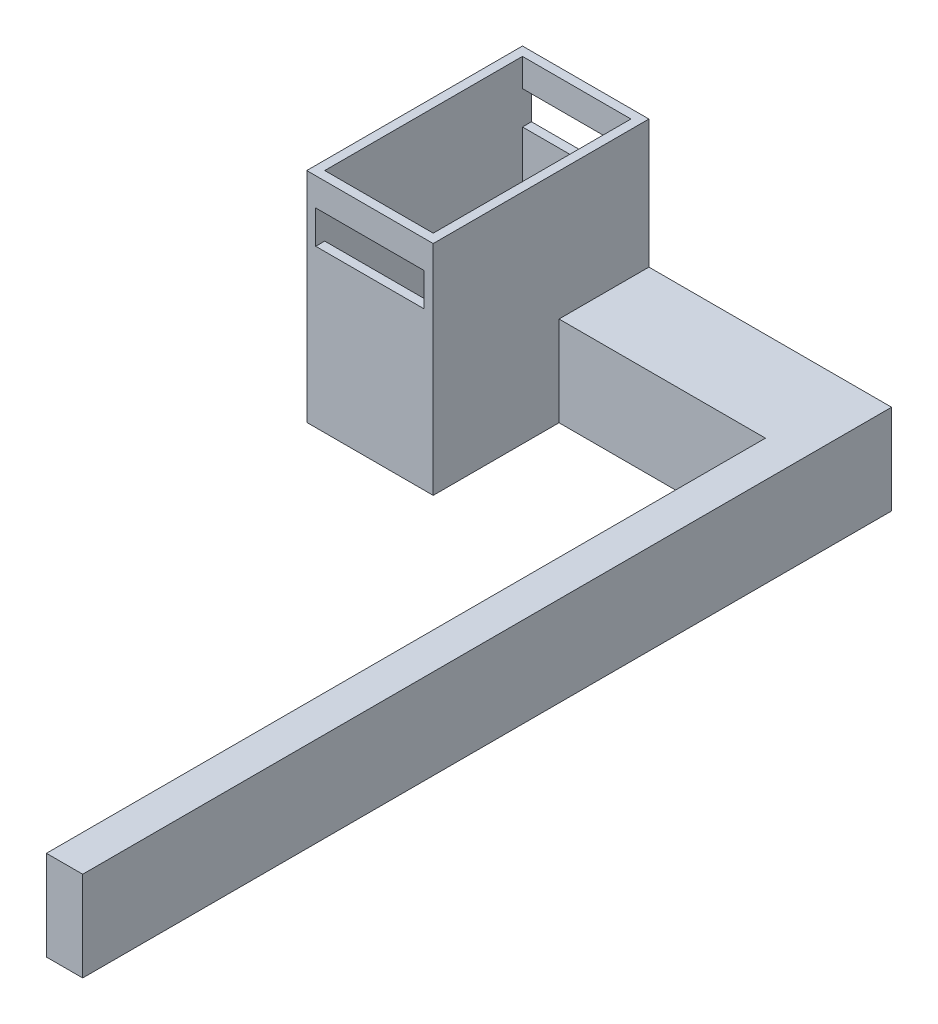
ISO-10303-21;
HEADER;
FILE_DESCRIPTION(('STEP AP214'),'2;1');
FILE_NAME('part.step','',(''),(''),'','','');
FILE_SCHEMA(('AUTOMOTIVE_DESIGN { 1 0 10303 214 1 1 1 1 }'));
ENDSEC;
DATA;
#1=APPLICATION_CONTEXT('core data for automotive mechanical design processes');
#2=APPLICATION_PROTOCOL_DEFINITION('international standard','automotive_design',2000,#1);
#3=PRODUCT_CONTEXT('',#1,'mechanical');
#4=PRODUCT('Part','Part','',(#3));
#5=PRODUCT_RELATED_PRODUCT_CATEGORY('part','',(#4));
#6=PRODUCT_DEFINITION_FORMATION('','',#4);
#7=PRODUCT_DEFINITION_CONTEXT('part definition',#1,'design');
#8=PRODUCT_DEFINITION('design','',#6,#7);
#9=PRODUCT_DEFINITION_SHAPE('','',#8);
#10=(LENGTH_UNIT() NAMED_UNIT(*) SI_UNIT(.MILLI.,.METRE.));
#11=(NAMED_UNIT(*) PLANE_ANGLE_UNIT() SI_UNIT($,.RADIAN.));
#12=(NAMED_UNIT(*) SI_UNIT($,.STERADIAN.) SOLID_ANGLE_UNIT());
#13=UNCERTAINTY_MEASURE_WITH_UNIT(LENGTH_MEASURE(1.E-05),#10,'distance_accuracy_value','');
#14=(GEOMETRIC_REPRESENTATION_CONTEXT(3) GLOBAL_UNCERTAINTY_ASSIGNED_CONTEXT((#13)) GLOBAL_UNIT_ASSIGNED_CONTEXT((#10,
#11,#12)) REPRESENTATION_CONTEXT('',''));
#15=CARTESIAN_POINT('',(0.,0.,0.));
#16=DIRECTION('',(0.,0.,1.));
#17=DIRECTION('',(1.,0.,0.));
#18=AXIS2_PLACEMENT_3D('',#15,#16,#17);
#19=CARTESIAN_POINT('',(41.07,0.,-14.));
#20=DIRECTION('',(0.,0.,-1.));
#21=DIRECTION('',(-1.,0.,0.));
#22=AXIS2_PLACEMENT_3D('',#19,#20,#21);
#23=PLANE('',#22);
#24=DIRECTION('',(0.,-1.,0.));
#25=VECTOR('',#24,1.);
#26=CARTESIAN_POINT('',(37.035,0.,-14.));
#27=LINE('',#26,#25);
#28=CARTESIAN_POINT('',(37.035,10.,-14.));
#29=VERTEX_POINT('',#28);
#30=CARTESIAN_POINT('',(37.035,0.,-14.));
#31=VERTEX_POINT('',#30);
#32=EDGE_CURVE('E220',#29,#31,#27,.T.);
#33=ORIENTED_EDGE('',*,*,#32,.F.);
#34=DIRECTION('',(-1.,0.,0.));
#35=VECTOR('',#34,1.);
#36=CARTESIAN_POINT('',(41.07,10.,-14.));
#37=LINE('',#36,#35);
#38=CARTESIAN_POINT('',(14.07,10.,-14.));
#39=VERTEX_POINT('',#38);
#40=EDGE_CURVE('E246',#29,#39,#37,.T.);
#41=ORIENTED_EDGE('',*,*,#40,.T.);
#42=DIRECTION('',(0.,-1.,0.));
#43=VECTOR('',#42,1.);
#44=CARTESIAN_POINT('',(14.07,0.,-14.));
#45=LINE('',#44,#43);
#46=CARTESIAN_POINT('',(14.07,0.,-14.));
#47=VERTEX_POINT('',#46);
#48=EDGE_CURVE('E235',#39,#47,#45,.T.);
#49=ORIENTED_EDGE('',*,*,#48,.T.);
#50=DIRECTION('',(-1.,0.,0.));
#51=VECTOR('',#50,1.);
#52=CARTESIAN_POINT('',(41.07,0.,-14.));
#53=LINE('',#52,#51);
#54=EDGE_CURVE('E67',#31,#47,#53,.T.);
#55=ORIENTED_EDGE('',*,*,#54,.F.);
#56=EDGE_LOOP('',(#33,#41,#49,#55));
#57=FACE_BOUND('',#56,.T.);
#58=ADVANCED_FACE('F43',(#57),#23,.F.);
#59=CARTESIAN_POINT('',(14.07,24.27,0.));
#60=DIRECTION('',(-1.,0.,0.));
#61=DIRECTION('',(0.,0.,1.));
#62=AXIS2_PLACEMENT_3D('',#59,#60,#61);
#63=PLANE('',#62);
#64=ORIENTED_EDGE('',*,*,#48,.F.);
#65=DIRECTION('',(0.,0.,1.));
#66=VECTOR('',#65,1.);
#67=CARTESIAN_POINT('',(14.07,10.,-24.));
#68=LINE('',#67,#66);
#69=CARTESIAN_POINT('',(14.07,10.,-24.));
#70=VERTEX_POINT('',#69);
#71=EDGE_CURVE('E59',#70,#39,#68,.T.);
#72=ORIENTED_EDGE('',*,*,#71,.F.);
#73=DIRECTION('',(0.,-1.,0.));
#74=VECTOR('',#73,1.);
#75=CARTESIAN_POINT('',(14.07,24.27,-24.));
#76=LINE('',#75,#74);
#77=CARTESIAN_POINT('',(14.07,24.27,-24.));
#78=VERTEX_POINT('',#77);
#79=EDGE_CURVE('E399',#78,#70,#76,.T.);
#80=ORIENTED_EDGE('',*,*,#79,.F.);
#81=DIRECTION('',(0.,0.,-1.));
#82=VECTOR('',#81,1.);
#83=CARTESIAN_POINT('',(14.07,24.27,0.));
#84=LINE('',#83,#82);
#85=CARTESIAN_POINT('',(14.07,24.27,0.));
#86=VERTEX_POINT('',#85);
#87=EDGE_CURVE('E378',#86,#78,#84,.T.);
#88=ORIENTED_EDGE('',*,*,#87,.F.);
#89=DIRECTION('',(0.,-1.,0.));
#90=VECTOR('',#89,1.);
#91=CARTESIAN_POINT('',(14.07,24.27,0.));
#92=LINE('',#91,#90);
#93=CARTESIAN_POINT('',(14.07,0.,0.));
#94=VERTEX_POINT('',#93);
#95=EDGE_CURVE('E52',#86,#94,#92,.T.);
#96=ORIENTED_EDGE('',*,*,#95,.T.);
#97=DIRECTION('',(0.,0.,-1.));
#98=VECTOR('',#97,1.);
#99=CARTESIAN_POINT('',(14.07,0.,0.));
#100=LINE('',#99,#98);
#101=EDGE_CURVE('E391',#94,#47,#100,.T.);
#102=ORIENTED_EDGE('',*,*,#101,.T.);
#103=EDGE_LOOP('',(#64,#72,#80,#88,#96,#102));
#104=FACE_BOUND('',#103,.T.);
#105=ADVANCED_FACE('F405',(#104),#63,.F.);
#106=CARTESIAN_POINT('',(13.07,1.,-23.));
#107=DIRECTION('',(0.,0.,-1.));
#108=DIRECTION('',(-1.,0.,0.));
#109=AXIS2_PLACEMENT_3D('',#106,#107,#108);
#110=PLANE('',#109);
#111=DIRECTION('',(0.,1.,0.));
#112=VECTOR('',#111,1.);
#113=CARTESIAN_POINT('',(13.07,1.,-23.));
#114=LINE('',#113,#112);
#115=CARTESIAN_POINT('',(13.07,1.,-23.));
#116=VERTEX_POINT('',#115);
#117=CARTESIAN_POINT('',(13.07,17.47,-23.));
#118=VERTEX_POINT('',#117);
#119=EDGE_CURVE('E350',#116,#118,#114,.T.);
#120=ORIENTED_EDGE('',*,*,#119,.T.);
#121=DIRECTION('',(-1.,0.,0.));
#122=VECTOR('',#121,1.);
#123=CARTESIAN_POINT('',(13.07,17.47,-23.));
#124=LINE('',#123,#122);
#125=CARTESIAN_POINT('',(1.,17.47,-23.));
#126=VERTEX_POINT('',#125);
#127=EDGE_CURVE('E301',#118,#126,#124,.T.);
#128=ORIENTED_EDGE('',*,*,#127,.T.);
#129=DIRECTION('',(0.,1.,0.));
#130=VECTOR('',#129,1.);
#131=CARTESIAN_POINT('',(1.,1.,-23.));
#132=LINE('',#131,#130);
#133=CARTESIAN_POINT('',(1.,1.,-23.));
#134=VERTEX_POINT('',#133);
#135=EDGE_CURVE('E366',#134,#126,#132,.T.);
#136=ORIENTED_EDGE('',*,*,#135,.F.);
#137=DIRECTION('',(-1.,0.,0.));
#138=VECTOR('',#137,1.);
#139=CARTESIAN_POINT('',(13.07,1.,-23.));
#140=LINE('',#139,#138);
#141=EDGE_CURVE('E318',#116,#134,#140,.T.);
#142=ORIENTED_EDGE('',*,*,#141,.F.);
#143=EDGE_LOOP('',(#120,#128,#136,#142));
#144=FACE_BOUND('',#143,.T.);
#145=ADVANCED_FACE('F435',(#144),#110,.F.);
#146=CARTESIAN_POINT('',(1.,1.,-1.));
#147=DIRECTION('',(0.,0.,1.));
#148=DIRECTION('',(1.,0.,0.));
#149=AXIS2_PLACEMENT_3D('',#146,#147,#148);
#150=PLANE('',#149);
#151=DIRECTION('',(0.,1.,0.));
#152=VECTOR('',#151,1.);
#153=CARTESIAN_POINT('',(1.,1.,-1.));
#154=LINE('',#153,#152);
#155=CARTESIAN_POINT('',(1.,1.,-1.));
#156=VERTEX_POINT('',#155);
#157=CARTESIAN_POINT('',(1.,17.47,-1.));
#158=VERTEX_POINT('',#157);
#159=EDGE_CURVE('E361',#156,#158,#154,.T.);
#160=ORIENTED_EDGE('',*,*,#159,.T.);
#161=DIRECTION('',(1.,0.,0.));
#162=VECTOR('',#161,1.);
#163=CARTESIAN_POINT('',(1.,17.47,-1.));
#164=LINE('',#163,#162);
#165=CARTESIAN_POINT('',(13.07,17.47,-1.));
#166=VERTEX_POINT('',#165);
#167=EDGE_CURVE('E297',#158,#166,#164,.T.);
#168=ORIENTED_EDGE('',*,*,#167,.T.);
#169=DIRECTION('',(0.,1.,0.));
#170=VECTOR('',#169,1.);
#171=CARTESIAN_POINT('',(13.07,1.,-1.));
#172=LINE('',#171,#170);
#173=CARTESIAN_POINT('',(13.07,1.,-1.));
#174=VERTEX_POINT('',#173);
#175=EDGE_CURVE('E356',#174,#166,#172,.T.);
#176=ORIENTED_EDGE('',*,*,#175,.F.);
#177=DIRECTION('',(1.,0.,0.));
#178=VECTOR('',#177,1.);
#179=CARTESIAN_POINT('',(1.,1.,-1.));
#180=LINE('',#179,#178);
#181=EDGE_CURVE('E327',#156,#174,#180,.T.);
#182=ORIENTED_EDGE('',*,*,#181,.F.);
#183=EDGE_LOOP('',(#160,#168,#176,#182));
#184=FACE_BOUND('',#183,.T.);
#185=ADVANCED_FACE('F464',(#184),#150,.F.);
#186=CARTESIAN_POINT('',(0.,24.27,0.));
#187=DIRECTION('',(1.,0.,0.));
#188=DIRECTION('',(0.,0.,-1.));
#189=AXIS2_PLACEMENT_3D('',#186,#187,#188);
#190=PLANE('',#189);
#191=DIRECTION('',(0.,0.,1.));
#192=VECTOR('',#191,1.);
#193=CARTESIAN_POINT('',(0.,0.,0.));
#194=LINE('',#193,#192);
#195=CARTESIAN_POINT('',(0.,0.,-24.));
#196=VERTEX_POINT('',#195);
#197=CARTESIAN_POINT('',(0.,0.,0.));
#198=VERTEX_POINT('',#197);
#199=EDGE_CURVE('E354',#196,#198,#194,.T.);
#200=ORIENTED_EDGE('',*,*,#199,.T.);
#201=DIRECTION('',(0.,-1.,0.));
#202=VECTOR('',#201,1.);
#203=CARTESIAN_POINT('',(0.,24.27,0.));
#204=LINE('',#203,#202);
#205=CARTESIAN_POINT('',(0.,24.27,0.));
#206=VERTEX_POINT('',#205);
#207=EDGE_CURVE('E11',#206,#198,#204,.T.);
#208=ORIENTED_EDGE('',*,*,#207,.F.);
#209=DIRECTION('',(0.,0.,1.));
#210=VECTOR('',#209,1.);
#211=CARTESIAN_POINT('',(0.,24.27,0.));
#212=LINE('',#211,#210);
#213=CARTESIAN_POINT('',(0.,24.27,-24.));
#214=VERTEX_POINT('',#213);
#215=EDGE_CURVE('E370',#214,#206,#212,.T.);
#216=ORIENTED_EDGE('',*,*,#215,.F.);
#217=DIRECTION('',(0.,-1.,0.));
#218=VECTOR('',#217,1.);
#219=CARTESIAN_POINT('',(0.,24.27,-24.));
#220=LINE('',#219,#218);
#221=EDGE_CURVE('E384',#214,#196,#220,.T.);
#222=ORIENTED_EDGE('',*,*,#221,.T.);
#223=EDGE_LOOP('',(#200,#208,#216,#222));
#224=FACE_BOUND('',#223,.T.);
#225=ADVANCED_FACE('F45',(#224),#190,.F.);
#226=CARTESIAN_POINT('',(0.,24.27,0.));
#227=DIRECTION('',(0.,0.,-1.));
#228=DIRECTION('',(-1.,0.,0.));
#229=AXIS2_PLACEMENT_3D('',#226,#227,#228);
#230=PLANE('',#229);
#231=DIRECTION('',(0.,-1.,0.));
#232=VECTOR('',#231,1.);
#233=CARTESIAN_POINT('',(13.07,21.1652594595806,0.));
#234=LINE('',#233,#232);
#235=CARTESIAN_POINT('',(13.07,21.1652594595806,0.));
#236=VERTEX_POINT('',#235);
#237=CARTESIAN_POINT('',(13.07,17.47,0.));
#238=VERTEX_POINT('',#237);
#239=EDGE_CURVE('E264',#236,#238,#234,.T.);
#240=ORIENTED_EDGE('',*,*,#239,.T.);
#241=DIRECTION('',(-1.,0.,0.));
#242=VECTOR('',#241,1.);
#243=CARTESIAN_POINT('',(13.07,17.47,0.));
#244=LINE('',#243,#242);
#245=CARTESIAN_POINT('',(1.,17.47,0.));
#246=VERTEX_POINT('',#245);
#247=EDGE_CURVE('E252',#238,#246,#244,.T.);
#248=ORIENTED_EDGE('',*,*,#247,.T.);
#249=DIRECTION('',(0.,1.,0.));
#250=VECTOR('',#249,1.);
#251=CARTESIAN_POINT('',(1.,17.47,0.));
#252=LINE('',#251,#250);
#253=CARTESIAN_POINT('',(1.,21.1652594595806,0.));
#254=VERTEX_POINT('',#253);
#255=EDGE_CURVE('E256',#246,#254,#252,.T.);
#256=ORIENTED_EDGE('',*,*,#255,.T.);
#257=DIRECTION('',(1.,0.,0.));
#258=VECTOR('',#257,1.);
#259=CARTESIAN_POINT('',(1.,21.1652594595806,0.));
#260=LINE('',#259,#258);
#261=EDGE_CURVE('E260',#254,#236,#260,.T.);
#262=ORIENTED_EDGE('',*,*,#261,.T.);
#263=EDGE_LOOP('',(#240,#248,#256,#262));
#264=FACE_BOUND('',#263,.T.);
#265=DIRECTION('',(1.,0.,0.));
#266=VECTOR('',#265,1.);
#267=CARTESIAN_POINT('',(0.,0.,0.));
#268=LINE('',#267,#266);
#269=EDGE_CURVE('E388',#198,#94,#268,.T.);
#270=ORIENTED_EDGE('',*,*,#269,.T.);
#271=ORIENTED_EDGE('',*,*,#95,.F.);
#272=DIRECTION('',(1.,0.,0.));
#273=VECTOR('',#272,1.);
#274=CARTESIAN_POINT('',(0.,24.27,0.));
#275=LINE('',#274,#273);
#276=EDGE_CURVE('E374',#206,#86,#275,.T.);
#277=ORIENTED_EDGE('',*,*,#276,.F.);
#278=ORIENTED_EDGE('',*,*,#207,.T.);
#279=EDGE_LOOP('',(#270,#271,#277,#278));
#280=FACE_BOUND('',#279,.T.);
#281=ADVANCED_FACE('F410',(#264,#280),#230,.F.);
#282=CARTESIAN_POINT('',(0.,24.27,-24.));
#283=DIRECTION('',(0.,0.,1.));
#284=DIRECTION('',(1.,0.,0.));
#285=AXIS2_PLACEMENT_3D('',#282,#283,#284);
#286=PLANE('',#285);
#287=DIRECTION('',(0.,-1.,0.));
#288=VECTOR('',#287,1.);
#289=CARTESIAN_POINT('',(1.,24.27,-24.));
#290=LINE('',#289,#288);
#291=CARTESIAN_POINT('',(1.,21.1652594595806,-24.));
#292=VERTEX_POINT('',#291);
#293=CARTESIAN_POINT('',(1.,17.47,-24.));
#294=VERTEX_POINT('',#293);
#295=EDGE_CURVE('E309',#292,#294,#290,.T.);
#296=ORIENTED_EDGE('',*,*,#295,.T.);
#297=DIRECTION('',(1.,0.,0.));
#298=VECTOR('',#297,1.);
#299=CARTESIAN_POINT('',(0.,17.47,-24.));
#300=LINE('',#299,#298);
#301=CARTESIAN_POINT('',(13.07,17.47,-24.));
#302=VERTEX_POINT('',#301);
#303=EDGE_CURVE('E305',#294,#302,#300,.T.);
#304=ORIENTED_EDGE('',*,*,#303,.T.);
#305=DIRECTION('',(0.,1.,0.));
#306=VECTOR('',#305,1.);
#307=CARTESIAN_POINT('',(13.07,24.27,-24.));
#308=LINE('',#307,#306);
#309=CARTESIAN_POINT('',(13.07,21.1652594595806,-24.));
#310=VERTEX_POINT('',#309);
#311=EDGE_CURVE('E313',#302,#310,#308,.T.);
#312=ORIENTED_EDGE('',*,*,#311,.T.);
#313=DIRECTION('',(-1.,0.,0.));
#314=VECTOR('',#313,1.);
#315=CARTESIAN_POINT('',(0.,21.1652594595806,-24.));
#316=LINE('',#315,#314);
#317=EDGE_CURVE('E293',#310,#292,#316,.T.);
#318=ORIENTED_EDGE('',*,*,#317,.T.);
#319=EDGE_LOOP('',(#296,#304,#312,#318));
#320=FACE_BOUND('',#319,.T.);
#321=DIRECTION('',(-1.,0.,0.));
#322=VECTOR('',#321,1.);
#323=CARTESIAN_POINT('',(0.,0.,-24.));
#324=LINE('',#323,#322);
#325=CARTESIAN_POINT('',(41.07,0.,-24.));
#326=VERTEX_POINT('',#325);
#327=EDGE_CURVE('E375',#326,#196,#324,.T.);
#328=ORIENTED_EDGE('',*,*,#327,.T.);
#329=ORIENTED_EDGE('',*,*,#221,.F.);
#330=DIRECTION('',(-1.,0.,0.));
#331=VECTOR('',#330,1.);
#332=CARTESIAN_POINT('',(0.,24.27,-24.));
#333=LINE('',#332,#331);
#334=EDGE_CURVE('E381',#78,#214,#333,.T.);
#335=ORIENTED_EDGE('',*,*,#334,.F.);
#336=ORIENTED_EDGE('',*,*,#79,.T.);
#337=DIRECTION('',(-1.,0.,0.));
#338=VECTOR('',#337,1.);
#339=CARTESIAN_POINT('',(41.07,10.,-24.));
#340=LINE('',#339,#338);
#341=CARTESIAN_POINT('',(41.07,10.,-24.));
#342=VERTEX_POINT('',#341);
#343=EDGE_CURVE('E249',#342,#70,#340,.T.);
#344=ORIENTED_EDGE('',*,*,#343,.F.);
#345=DIRECTION('',(0.,1.,0.));
#346=VECTOR('',#345,1.);
#347=CARTESIAN_POINT('',(41.07,0.,-24.));
#348=LINE('',#347,#346);
#349=EDGE_CURVE('E198',#326,#342,#348,.T.);
#350=ORIENTED_EDGE('',*,*,#349,.F.);
#351=EDGE_LOOP('',(#328,#329,#335,#336,#344,#350));
#352=FACE_BOUND('',#351,.T.);
#353=ADVANCED_FACE('F416',(#320,#352),#286,.F.);
#354=CARTESIAN_POINT('',(0.,24.27,0.));
#355=DIRECTION('',(0.,-1.,0.));
#356=DIRECTION('',(0.,0.,-1.));
#357=AXIS2_PLACEMENT_3D('',#354,#355,#356);
#358=PLANE('',#357);
#359=DIRECTION('',(0.,0.,1.));
#360=VECTOR('',#359,1.);
#361=CARTESIAN_POINT('',(1.,24.27,-23.));
#362=LINE('',#361,#360);
#363=CARTESIAN_POINT('',(1.,24.27,-23.));
#364=VERTEX_POINT('',#363);
#365=CARTESIAN_POINT('',(1.,24.27,-1.));
#366=VERTEX_POINT('',#365);
#367=EDGE_CURVE('E339',#364,#366,#362,.T.);
#368=ORIENTED_EDGE('',*,*,#367,.F.);
#369=DIRECTION('',(-1.,0.,0.));
#370=VECTOR('',#369,1.);
#371=CARTESIAN_POINT('',(13.07,24.27,-23.));
#372=LINE('',#371,#370);
#373=CARTESIAN_POINT('',(13.07,24.27,-23.));
#374=VERTEX_POINT('',#373);
#375=EDGE_CURVE('E317',#374,#364,#372,.T.);
#376=ORIENTED_EDGE('',*,*,#375,.F.);
#377=DIRECTION('',(0.,0.,-1.));
#378=VECTOR('',#377,1.);
#379=CARTESIAN_POINT('',(13.07,24.27,-1.));
#380=LINE('',#379,#378);
#381=CARTESIAN_POINT('',(13.07,24.27,-1.));
#382=VERTEX_POINT('',#381);
#383=EDGE_CURVE('E323',#382,#374,#380,.T.);
#384=ORIENTED_EDGE('',*,*,#383,.F.);
#385=DIRECTION('',(1.,0.,0.));
#386=VECTOR('',#385,1.);
#387=CARTESIAN_POINT('',(1.,24.27,-1.));
#388=LINE('',#387,#386);
#389=EDGE_CURVE('E343',#366,#382,#388,.T.);
#390=ORIENTED_EDGE('',*,*,#389,.F.);
#391=EDGE_LOOP('',(#368,#376,#384,#390));
#392=FACE_BOUND('',#391,.T.);
#393=ORIENTED_EDGE('',*,*,#215,.T.);
#394=ORIENTED_EDGE('',*,*,#276,.T.);
#395=ORIENTED_EDGE('',*,*,#87,.T.);
#396=ORIENTED_EDGE('',*,*,#334,.T.);
#397=EDGE_LOOP('',(#393,#394,#395,#396));
#398=FACE_BOUND('',#397,.T.);
#399=ADVANCED_FACE('F471',(#392,#398),#358,.F.);
#400=CARTESIAN_POINT('',(0.,0.,0.));
#401=DIRECTION('',(0.,-1.,0.));
#402=DIRECTION('',(0.,0.,-1.));
#403=AXIS2_PLACEMENT_3D('',#400,#401,#402);
#404=PLANE('',#403);
#405=ORIENTED_EDGE('',*,*,#199,.F.);
#406=ORIENTED_EDGE('',*,*,#327,.F.);
#407=DIRECTION('',(0.,0.,-1.));
#408=VECTOR('',#407,1.);
#409=CARTESIAN_POINT('',(41.07,0.,-24.));
#410=LINE('',#409,#408);
#411=CARTESIAN_POINT('',(41.07,0.,66.));
#412=VERTEX_POINT('',#411);
#413=EDGE_CURVE('E203',#412,#326,#410,.T.);
#414=ORIENTED_EDGE('',*,*,#413,.F.);
#415=DIRECTION('',(1.,0.,0.));
#416=VECTOR('',#415,1.);
#417=CARTESIAN_POINT('',(41.07,0.,66.));
#418=LINE('',#417,#416);
#419=CARTESIAN_POINT('',(37.035,0.,66.));
#420=VERTEX_POINT('',#419);
#421=EDGE_CURVE('E218',#420,#412,#418,.T.);
#422=ORIENTED_EDGE('',*,*,#421,.F.);
#423=DIRECTION('',(0.,0.,-1.));
#424=VECTOR('',#423,1.);
#425=CARTESIAN_POINT('',(37.035,0.,66.));
#426=LINE('',#425,#424);
#427=EDGE_CURVE('E228',#420,#31,#426,.T.);
#428=ORIENTED_EDGE('',*,*,#427,.T.);
#429=ORIENTED_EDGE('',*,*,#54,.T.);
#430=ORIENTED_EDGE('',*,*,#101,.F.);
#431=ORIENTED_EDGE('',*,*,#269,.F.);
#432=EDGE_LOOP('',(#405,#406,#414,#422,#428,#429,#430,#431));
#433=FACE_BOUND('',#432,.T.);
#434=ADVANCED_FACE('F408',(#433),#404,.T.);
#435=CARTESIAN_POINT('',(1.,21.1652594595806,-23.));
#436=VERTEX_POINT('',#435);
#437=EDGE_CURVE('E335',#436,#364,#132,.T.);
#438=ORIENTED_EDGE('',*,*,#437,.F.);
#439=DIRECTION('',(1.,0.,0.));
#440=VECTOR('',#439,1.);
#441=CARTESIAN_POINT('',(13.07,21.1652594595806,-23.));
#442=LINE('',#441,#440);
#443=CARTESIAN_POINT('',(13.07,21.1652594595806,-23.));
#444=VERTEX_POINT('',#443);
#445=EDGE_CURVE('E289',#436,#444,#442,.T.);
#446=ORIENTED_EDGE('',*,*,#445,.T.);
#447=EDGE_CURVE('E355',#444,#374,#114,.T.);
#448=ORIENTED_EDGE('',*,*,#447,.T.);
#449=ORIENTED_EDGE('',*,*,#375,.T.);
#450=EDGE_LOOP('',(#438,#446,#448,#449));
#451=FACE_BOUND('',#450,.T.);
#452=ADVANCED_FACE('F459',(#451),#110,.F.);
#453=CARTESIAN_POINT('',(13.07,1.,-1.));
#454=DIRECTION('',(1.,0.,0.));
#455=DIRECTION('',(0.,0.,-1.));
#456=AXIS2_PLACEMENT_3D('',#453,#454,#455);
#457=PLANE('',#456);
#458=ORIENTED_EDGE('',*,*,#447,.F.);
#459=DIRECTION('',(0.,0.,-1.));
#460=VECTOR('',#459,1.);
#461=CARTESIAN_POINT('',(13.07,21.1652594595806,0.));
#462=LINE('',#461,#460);
#463=EDGE_CURVE('E278',#444,#310,#462,.T.);
#464=ORIENTED_EDGE('',*,*,#463,.T.);
#465=ORIENTED_EDGE('',*,*,#311,.F.);
#466=DIRECTION('',(0.,0.,-1.));
#467=VECTOR('',#466,1.);
#468=CARTESIAN_POINT('',(13.07,17.47,0.));
#469=LINE('',#468,#467);
#470=EDGE_CURVE('E273',#118,#302,#469,.T.);
#471=ORIENTED_EDGE('',*,*,#470,.F.);
#472=ORIENTED_EDGE('',*,*,#119,.F.);
#473=DIRECTION('',(0.,0.,-1.));
#474=VECTOR('',#473,1.);
#475=CARTESIAN_POINT('',(13.07,1.,-1.));
#476=LINE('',#475,#474);
#477=EDGE_CURVE('E331',#174,#116,#476,.T.);
#478=ORIENTED_EDGE('',*,*,#477,.F.);
#479=ORIENTED_EDGE('',*,*,#175,.T.);
#480=EDGE_CURVE('E269',#238,#166,#469,.T.);
#481=ORIENTED_EDGE('',*,*,#480,.F.);
#482=ORIENTED_EDGE('',*,*,#239,.F.);
#483=CARTESIAN_POINT('',(13.07,21.1652594595806,-1.));
#484=VERTEX_POINT('',#483);
#485=EDGE_CURVE('E274',#236,#484,#462,.T.);
#486=ORIENTED_EDGE('',*,*,#485,.T.);
#487=EDGE_CURVE('E360',#484,#382,#172,.T.);
#488=ORIENTED_EDGE('',*,*,#487,.T.);
#489=ORIENTED_EDGE('',*,*,#383,.T.);
#490=EDGE_LOOP('',(#458,#464,#465,#471,#472,#478,#479,#481,#482,#486,#488,#489));
#491=FACE_BOUND('',#490,.T.);
#492=ADVANCED_FACE('F455',(#491),#457,.F.);
#493=ORIENTED_EDGE('',*,*,#487,.F.);
#494=DIRECTION('',(-1.,0.,0.));
#495=VECTOR('',#494,1.);
#496=CARTESIAN_POINT('',(1.,21.1652594595806,-1.));
#497=LINE('',#496,#495);
#498=CARTESIAN_POINT('',(1.,21.1652594595806,-1.));
#499=VERTEX_POINT('',#498);
#500=EDGE_CURVE('E272',#484,#499,#497,.T.);
#501=ORIENTED_EDGE('',*,*,#500,.T.);
#502=EDGE_CURVE('E365',#499,#366,#154,.T.);
#503=ORIENTED_EDGE('',*,*,#502,.T.);
#504=ORIENTED_EDGE('',*,*,#389,.T.);
#505=EDGE_LOOP('',(#493,#501,#503,#504));
#506=FACE_BOUND('',#505,.T.);
#507=ADVANCED_FACE('F458',(#506),#150,.F.);
#508=CARTESIAN_POINT('',(1.,1.,-23.));
#509=DIRECTION('',(-1.,0.,0.));
#510=DIRECTION('',(0.,0.,1.));
#511=AXIS2_PLACEMENT_3D('',#508,#509,#510);
#512=PLANE('',#511);
#513=ORIENTED_EDGE('',*,*,#502,.F.);
#514=DIRECTION('',(0.,0.,-1.));
#515=VECTOR('',#514,1.);
#516=CARTESIAN_POINT('',(1.,21.1652594595806,0.));
#517=LINE('',#516,#515);
#518=EDGE_CURVE('E279',#254,#499,#517,.T.);
#519=ORIENTED_EDGE('',*,*,#518,.F.);
#520=ORIENTED_EDGE('',*,*,#255,.F.);
#521=DIRECTION('',(0.,0.,-1.));
#522=VECTOR('',#521,1.);
#523=CARTESIAN_POINT('',(1.,17.47,0.));
#524=LINE('',#523,#522);
#525=EDGE_CURVE('E283',#246,#158,#524,.T.);
#526=ORIENTED_EDGE('',*,*,#525,.T.);
#527=ORIENTED_EDGE('',*,*,#159,.F.);
#528=DIRECTION('',(0.,0.,1.));
#529=VECTOR('',#528,1.);
#530=CARTESIAN_POINT('',(1.,1.,-23.));
#531=LINE('',#530,#529);
#532=EDGE_CURVE('E322',#134,#156,#531,.T.);
#533=ORIENTED_EDGE('',*,*,#532,.F.);
#534=ORIENTED_EDGE('',*,*,#135,.T.);
#535=EDGE_CURVE('E268',#126,#294,#524,.T.);
#536=ORIENTED_EDGE('',*,*,#535,.T.);
#537=ORIENTED_EDGE('',*,*,#295,.F.);
#538=EDGE_CURVE('E282',#436,#292,#517,.T.);
#539=ORIENTED_EDGE('',*,*,#538,.F.);
#540=ORIENTED_EDGE('',*,*,#437,.T.);
#541=ORIENTED_EDGE('',*,*,#367,.T.);
#542=EDGE_LOOP('',(#513,#519,#520,#526,#527,#533,#534,#536,#537,#539,#540,#541));
#543=FACE_BOUND('',#542,.T.);
#544=ADVANCED_FACE('F453',(#543),#512,.F.);
#545=CARTESIAN_POINT('',(0.,1.,0.));
#546=DIRECTION('',(0.,1.,0.));
#547=DIRECTION('',(0.,0.,1.));
#548=AXIS2_PLACEMENT_3D('',#545,#546,#547);
#549=PLANE('',#548);
#550=ORIENTED_EDGE('',*,*,#141,.T.);
#551=ORIENTED_EDGE('',*,*,#532,.T.);
#552=ORIENTED_EDGE('',*,*,#181,.T.);
#553=ORIENTED_EDGE('',*,*,#477,.T.);
#554=EDGE_LOOP('',(#550,#551,#552,#553));
#555=FACE_BOUND('',#554,.T.);
#556=ADVANCED_FACE('F450',(#555),#549,.T.);
#557=CARTESIAN_POINT('',(1.,21.1652594595806,0.));
#558=DIRECTION('',(0.,1.,0.));
#559=DIRECTION('',(0.,0.,1.));
#560=AXIS2_PLACEMENT_3D('',#557,#558,#559);
#561=PLANE('',#560);
#562=ORIENTED_EDGE('',*,*,#485,.F.);
#563=ORIENTED_EDGE('',*,*,#261,.F.);
#564=ORIENTED_EDGE('',*,*,#518,.T.);
#565=ORIENTED_EDGE('',*,*,#500,.F.);
#566=EDGE_LOOP('',(#562,#563,#564,#565));
#567=FACE_BOUND('',#566,.T.);
#568=ADVANCED_FACE('F445',(#567),#561,.F.);
#569=CARTESIAN_POINT('',(13.07,17.47,0.));
#570=DIRECTION('',(0.,-1.,0.));
#571=DIRECTION('',(0.,0.,-1.));
#572=AXIS2_PLACEMENT_3D('',#569,#570,#571);
#573=PLANE('',#572);
#574=ORIENTED_EDGE('',*,*,#525,.F.);
#575=ORIENTED_EDGE('',*,*,#247,.F.);
#576=ORIENTED_EDGE('',*,*,#480,.T.);
#577=ORIENTED_EDGE('',*,*,#167,.F.);
#578=EDGE_LOOP('',(#574,#575,#576,#577));
#579=FACE_BOUND('',#578,.T.);
#580=ADVANCED_FACE('F448',(#579),#573,.F.);
#581=ORIENTED_EDGE('',*,*,#535,.F.);
#582=ORIENTED_EDGE('',*,*,#127,.F.);
#583=ORIENTED_EDGE('',*,*,#470,.T.);
#584=ORIENTED_EDGE('',*,*,#303,.F.);
#585=EDGE_LOOP('',(#581,#582,#583,#584));
#586=FACE_BOUND('',#585,.T.);
#587=ADVANCED_FACE('F443',(#586),#573,.F.);
#588=ORIENTED_EDGE('',*,*,#463,.F.);
#589=ORIENTED_EDGE('',*,*,#445,.F.);
#590=ORIENTED_EDGE('',*,*,#538,.T.);
#591=ORIENTED_EDGE('',*,*,#317,.F.);
#592=EDGE_LOOP('',(#588,#589,#590,#591));
#593=FACE_BOUND('',#592,.T.);
#594=ADVANCED_FACE('F440',(#593),#561,.F.);
#595=CARTESIAN_POINT('',(41.07,10.,-24.));
#596=DIRECTION('',(0.,-1.,0.));
#597=DIRECTION('',(0.,0.,-1.));
#598=AXIS2_PLACEMENT_3D('',#595,#596,#597);
#599=PLANE('',#598);
#600=ORIENTED_EDGE('',*,*,#71,.T.);
#601=ORIENTED_EDGE('',*,*,#40,.F.);
#602=DIRECTION('',(0.,0.,-1.));
#603=VECTOR('',#602,1.);
#604=CARTESIAN_POINT('',(37.035,10.,66.));
#605=LINE('',#604,#603);
#606=CARTESIAN_POINT('',(37.035,10.,66.));
#607=VERTEX_POINT('',#606);
#608=EDGE_CURVE('E209',#607,#29,#605,.T.);
#609=ORIENTED_EDGE('',*,*,#608,.F.);
#610=DIRECTION('',(-1.,0.,0.));
#611=VECTOR('',#610,1.);
#612=CARTESIAN_POINT('',(41.07,10.,66.));
#613=LINE('',#612,#611);
#614=CARTESIAN_POINT('',(41.07,10.,66.));
#615=VERTEX_POINT('',#614);
#616=EDGE_CURVE('E206',#615,#607,#613,.T.);
#617=ORIENTED_EDGE('',*,*,#616,.F.);
#618=DIRECTION('',(0.,0.,1.));
#619=VECTOR('',#618,1.);
#620=CARTESIAN_POINT('',(41.07,10.,-24.));
#621=LINE('',#620,#619);
#622=EDGE_CURVE('E191',#342,#615,#621,.T.);
#623=ORIENTED_EDGE('',*,*,#622,.F.);
#624=ORIENTED_EDGE('',*,*,#343,.T.);
#625=EDGE_LOOP('',(#600,#601,#609,#617,#623,#624));
#626=FACE_BOUND('',#625,.T.);
#627=ADVANCED_FACE('F207',(#626),#599,.F.);
#628=CARTESIAN_POINT('',(41.07,0.,0.));
#629=DIRECTION('',(1.,0.,0.));
#630=DIRECTION('',(0.,0.,-1.));
#631=AXIS2_PLACEMENT_3D('',#628,#629,#630);
#632=PLANE('',#631);
#633=ORIENTED_EDGE('',*,*,#349,.T.);
#634=ORIENTED_EDGE('',*,*,#622,.T.);
#635=DIRECTION('',(0.,1.,0.));
#636=VECTOR('',#635,1.);
#637=CARTESIAN_POINT('',(41.07,0.,66.));
#638=LINE('',#637,#636);
#639=EDGE_CURVE('E196',#412,#615,#638,.T.);
#640=ORIENTED_EDGE('',*,*,#639,.F.);
#641=ORIENTED_EDGE('',*,*,#413,.T.);
#642=EDGE_LOOP('',(#633,#634,#640,#641));
#643=FACE_BOUND('',#642,.T.);
#644=ADVANCED_FACE('F193',(#643),#632,.T.);
#645=CARTESIAN_POINT('',(37.035,0.,66.));
#646=DIRECTION('',(1.,0.,0.));
#647=DIRECTION('',(0.,0.,-1.));
#648=AXIS2_PLACEMENT_3D('',#645,#646,#647);
#649=PLANE('',#648);
#650=ORIENTED_EDGE('',*,*,#32,.T.);
#651=ORIENTED_EDGE('',*,*,#427,.F.);
#652=DIRECTION('',(0.,-1.,0.));
#653=VECTOR('',#652,1.);
#654=CARTESIAN_POINT('',(37.035,0.,66.));
#655=LINE('',#654,#653);
#656=EDGE_CURVE('E213',#607,#420,#655,.T.);
#657=ORIENTED_EDGE('',*,*,#656,.F.);
#658=ORIENTED_EDGE('',*,*,#608,.T.);
#659=EDGE_LOOP('',(#650,#651,#657,#658));
#660=FACE_BOUND('',#659,.T.);
#661=ADVANCED_FACE('F421',(#660),#649,.F.);
#662=CARTESIAN_POINT('',(0.,0.,66.));
#663=DIRECTION('',(0.,0.,1.));
#664=DIRECTION('',(1.,0.,0.));
#665=AXIS2_PLACEMENT_3D('',#662,#663,#664);
#666=PLANE('',#665);
#667=ORIENTED_EDGE('',*,*,#639,.T.);
#668=ORIENTED_EDGE('',*,*,#616,.T.);
#669=ORIENTED_EDGE('',*,*,#656,.T.);
#670=ORIENTED_EDGE('',*,*,#421,.T.);
#671=EDGE_LOOP('',(#667,#668,#669,#670));
#672=FACE_BOUND('',#671,.T.);
#673=ADVANCED_FACE('F216',(#672),#666,.T.);
#674=CLOSED_SHELL('',(#58,#105,#145,#185,#225,#281,#353,#399,#434,#452,#492,#507,#544,#556,#568,
#580,#587,#594,#627,#644,#661,#673));
#675=MANIFOLD_SOLID_BREP('B2',#674);
#676=ADVANCED_BREP_SHAPE_REPRESENTATION('',(#18,#675),#14);
#677=SHAPE_DEFINITION_REPRESENTATION(#9,#676);
ENDSEC;
END-ISO-10303-21;
